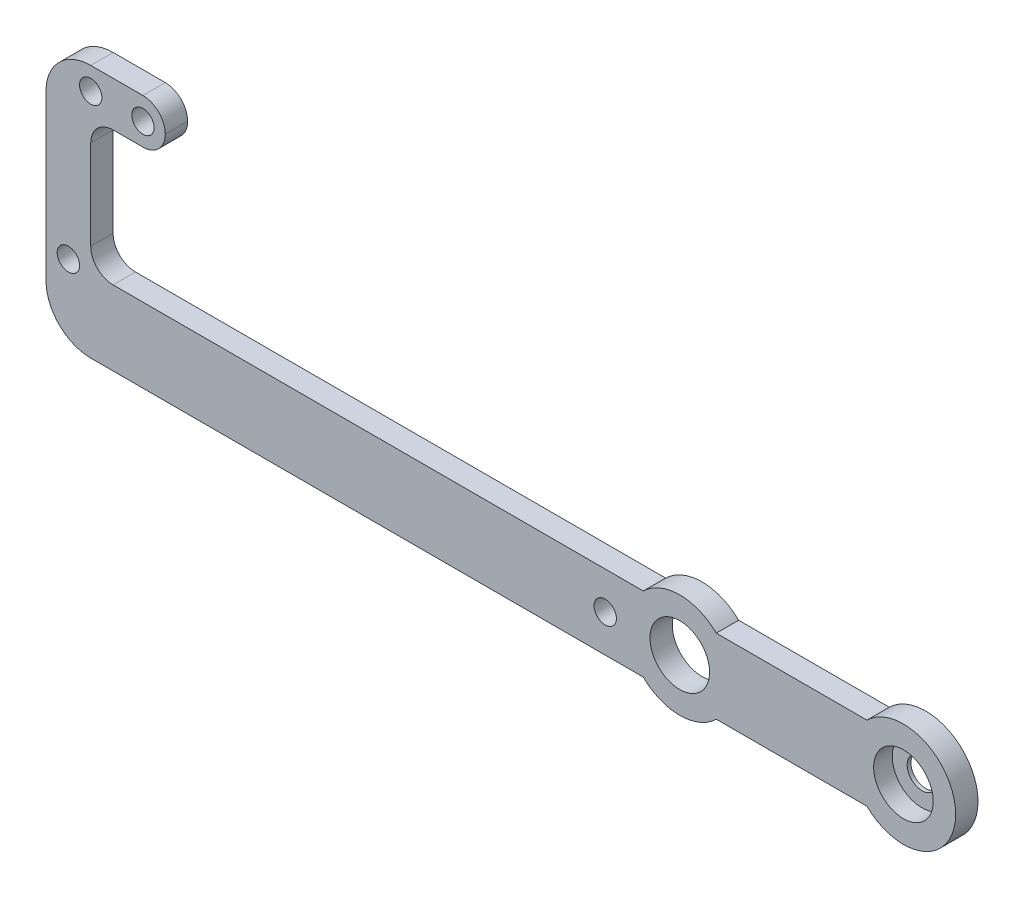
ISO-10303-21;
HEADER;
FILE_DESCRIPTION(('STEP AP214'),'2;1');
FILE_NAME('part.step','',(''),(''),'','','');
FILE_SCHEMA(('AUTOMOTIVE_DESIGN { 1 0 10303 214 1 1 1 1 }'));
ENDSEC;
DATA;
#1=APPLICATION_CONTEXT('core data for automotive mechanical design processes');
#2=APPLICATION_PROTOCOL_DEFINITION('international standard','automotive_design',2000,#1);
#3=PRODUCT_CONTEXT('',#1,'mechanical');
#4=PRODUCT('Part','Part','',(#3));
#5=PRODUCT_RELATED_PRODUCT_CATEGORY('part','',(#4));
#6=PRODUCT_DEFINITION_FORMATION('','',#4);
#7=PRODUCT_DEFINITION_CONTEXT('part definition',#1,'design');
#8=PRODUCT_DEFINITION('design','',#6,#7);
#9=PRODUCT_DEFINITION_SHAPE('','',#8);
#10=(LENGTH_UNIT() NAMED_UNIT(*) SI_UNIT(.MILLI.,.METRE.));
#11=(NAMED_UNIT(*) PLANE_ANGLE_UNIT() SI_UNIT($,.RADIAN.));
#12=(NAMED_UNIT(*) SI_UNIT($,.STERADIAN.) SOLID_ANGLE_UNIT());
#13=UNCERTAINTY_MEASURE_WITH_UNIT(LENGTH_MEASURE(1.E-05),#10,'distance_accuracy_value','');
#14=(GEOMETRIC_REPRESENTATION_CONTEXT(3) GLOBAL_UNCERTAINTY_ASSIGNED_CONTEXT((#13)) GLOBAL_UNIT_ASSIGNED_CONTEXT((#10,
#11,#12)) REPRESENTATION_CONTEXT('',''));
#15=CARTESIAN_POINT('',(0.,0.,0.));
#16=DIRECTION('',(0.,0.,1.));
#17=DIRECTION('',(1.,0.,0.));
#18=AXIS2_PLACEMENT_3D('',#15,#16,#17);
#19=CARTESIAN_POINT('',(0.,0.,3.));
#20=DIRECTION('',(1.,0.,0.));
#21=DIRECTION('',(0.,0.,-1.));
#22=AXIS2_PLACEMENT_3D('',#19,#20,#21);
#23=PLANE('',#22);
#24=DIRECTION('',(0.,-1.,0.));
#25=VECTOR('',#24,1.);
#26=CARTESIAN_POINT('',(0.,0.,0.));
#27=LINE('',#26,#25);
#28=CARTESIAN_POINT('',(0.,28.,0.));
#29=VERTEX_POINT('',#28);
#30=CARTESIAN_POINT('',(0.,6.,0.));
#31=VERTEX_POINT('',#30);
#32=EDGE_CURVE('E221',#29,#31,#27,.T.);
#33=ORIENTED_EDGE('',*,*,#32,.T.);
#34=DIRECTION('',(0.,0.,-1.));
#35=VECTOR('',#34,1.);
#36=CARTESIAN_POINT('',(0.,6.,3.));
#37=LINE('',#36,#35);
#38=CARTESIAN_POINT('',(0.,6.,3.));
#39=VERTEX_POINT('',#38);
#40=EDGE_CURVE('E63',#31,#39,#37,.F.);
#41=ORIENTED_EDGE('',*,*,#40,.T.);
#42=DIRECTION('',(0.,-1.,0.));
#43=VECTOR('',#42,1.);
#44=CARTESIAN_POINT('',(0.,0.,3.));
#45=LINE('',#44,#43);
#46=CARTESIAN_POINT('',(0.,28.,3.));
#47=VERTEX_POINT('',#46);
#48=EDGE_CURVE('E173',#47,#39,#45,.T.);
#49=ORIENTED_EDGE('',*,*,#48,.F.);
#50=DIRECTION('',(0.,0.,-1.));
#51=VECTOR('',#50,1.);
#52=CARTESIAN_POINT('',(0.,28.,3.));
#53=LINE('',#52,#51);
#54=EDGE_CURVE('E333',#47,#29,#53,.T.);
#55=ORIENTED_EDGE('',*,*,#54,.T.);
#56=EDGE_LOOP('',(#33,#41,#49,#55));
#57=FACE_BOUND('',#56,.T.);
#58=ADVANCED_FACE('F39',(#57),#23,.F.);
#59=CARTESIAN_POINT('',(0.,0.,3.));
#60=DIRECTION('',(0.,1.,0.));
#61=DIRECTION('',(0.,0.,1.));
#62=AXIS2_PLACEMENT_3D('',#59,#60,#61);
#63=PLANE('',#62);
#64=DIRECTION('',(1.,0.,0.));
#65=VECTOR('',#64,1.);
#66=CARTESIAN_POINT('',(0.,0.,3.));
#67=LINE('',#66,#65);
#68=CARTESIAN_POINT('',(6.,0.,3.));
#69=VERTEX_POINT('',#68);
#70=CARTESIAN_POINT('',(80.1010205144337,0.,3.));
#71=VERTEX_POINT('',#70);
#72=EDGE_CURVE('E162',#69,#71,#67,.T.);
#73=ORIENTED_EDGE('',*,*,#72,.F.);
#74=DIRECTION('',(0.,0.,-1.));
#75=VECTOR('',#74,1.);
#76=CARTESIAN_POINT('',(6.,0.,3.));
#77=LINE('',#76,#75);
#78=CARTESIAN_POINT('',(6.,0.,0.));
#79=VERTEX_POINT('',#78);
#80=EDGE_CURVE('E318',#69,#79,#77,.T.);
#81=ORIENTED_EDGE('',*,*,#80,.T.);
#82=DIRECTION('',(1.,0.,0.));
#83=VECTOR('',#82,1.);
#84=CARTESIAN_POINT('',(0.,0.,0.));
#85=LINE('',#84,#83);
#86=CARTESIAN_POINT('',(80.1010205144337,0.,0.));
#87=VERTEX_POINT('',#86);
#88=EDGE_CURVE('E179',#79,#87,#85,.T.);
#89=ORIENTED_EDGE('',*,*,#88,.T.);
#90=DIRECTION('',(0.,0.,-1.));
#91=VECTOR('',#90,1.);
#92=CARTESIAN_POINT('',(80.1010205144337,0.,3.));
#93=LINE('',#92,#91);
#94=EDGE_CURVE('E176',#71,#87,#93,.T.);
#95=ORIENTED_EDGE('',*,*,#94,.F.);
#96=EDGE_LOOP('',(#73,#81,#89,#95));
#97=FACE_BOUND('',#96,.T.);
#98=ADVANCED_FACE('F177',(#97),#63,.F.);
#99=CARTESIAN_POINT('',(85.,5.,3.));
#100=DIRECTION('',(0.,0.,-1.));
#101=DIRECTION('',(-1.,0.,0.));
#102=AXIS2_PLACEMENT_3D('',#99,#100,#101);
#103=CYLINDRICAL_SURFACE('',#102,7.);
#104=CARTESIAN_POINT('',(85.,5.,0.));
#105=DIRECTION('',(0.,0.,1.));
#106=DIRECTION('',(1.,0.,0.));
#107=AXIS2_PLACEMENT_3D('',#104,#105,#106);
#108=CIRCLE('',#107,7.);
#109=CARTESIAN_POINT('',(89.8989794855664,0.,0.));
#110=VERTEX_POINT('',#109);
#111=EDGE_CURVE('E227',#87,#110,#108,.T.);
#112=ORIENTED_EDGE('',*,*,#111,.T.);
#113=DIRECTION('',(0.,0.,-1.));
#114=VECTOR('',#113,1.);
#115=CARTESIAN_POINT('',(89.8989794855664,0.,3.));
#116=LINE('',#115,#114);
#117=CARTESIAN_POINT('',(89.8989794855664,0.,3.));
#118=VERTEX_POINT('',#117);
#119=EDGE_CURVE('E184',#118,#110,#116,.T.);
#120=ORIENTED_EDGE('',*,*,#119,.F.);
#121=CARTESIAN_POINT('',(85.,5.,3.));
#122=DIRECTION('',(0.,0.,1.));
#123=DIRECTION('',(1.,0.,0.));
#124=AXIS2_PLACEMENT_3D('',#121,#122,#123);
#125=CIRCLE('',#124,7.);
#126=EDGE_CURVE('E166',#71,#118,#125,.T.);
#127=ORIENTED_EDGE('',*,*,#126,.F.);
#128=ORIENTED_EDGE('',*,*,#94,.T.);
#129=EDGE_LOOP('',(#112,#120,#127,#128));
#130=FACE_BOUND('',#129,.T.);
#131=ADVANCED_FACE('F186',(#130),#103,.T.);
#132=CARTESIAN_POINT('',(89.8989794855664,0.,3.));
#133=DIRECTION('',(0.,1.,0.));
#134=DIRECTION('',(-1.,0.,0.));
#135=AXIS2_PLACEMENT_3D('',#132,#133,#134);
#136=PLANE('',#135);
#137=DIRECTION('',(1.,0.,0.));
#138=VECTOR('',#137,1.);
#139=CARTESIAN_POINT('',(89.8989794855664,0.,0.));
#140=LINE('',#139,#138);
#141=CARTESIAN_POINT('',(110.101020514434,0.,0.));
#142=VERTEX_POINT('',#141);
#143=EDGE_CURVE('E230',#110,#142,#140,.T.);
#144=ORIENTED_EDGE('',*,*,#143,.T.);
#145=DIRECTION('',(0.,0.,-1.));
#146=VECTOR('',#145,1.);
#147=CARTESIAN_POINT('',(110.101020514434,0.,3.));
#148=LINE('',#147,#146);
#149=CARTESIAN_POINT('',(110.101020514434,0.,3.));
#150=VERTEX_POINT('',#149);
#151=EDGE_CURVE('E268',#150,#142,#148,.T.);
#152=ORIENTED_EDGE('',*,*,#151,.F.);
#153=DIRECTION('',(1.,0.,0.));
#154=VECTOR('',#153,1.);
#155=CARTESIAN_POINT('',(89.8989794855664,0.,3.));
#156=LINE('',#155,#154);
#157=EDGE_CURVE('E190',#118,#150,#156,.T.);
#158=ORIENTED_EDGE('',*,*,#157,.F.);
#159=ORIENTED_EDGE('',*,*,#119,.T.);
#160=EDGE_LOOP('',(#144,#152,#158,#159));
#161=FACE_BOUND('',#160,.T.);
#162=ADVANCED_FACE('F376',(#161),#136,.F.);
#163=CARTESIAN_POINT('',(115.,5.,3.));
#164=DIRECTION('',(0.,0.,-1.));
#165=DIRECTION('',(-1.,0.,0.));
#166=AXIS2_PLACEMENT_3D('',#163,#164,#165);
#167=CYLINDRICAL_SURFACE('',#166,7.);
#168=CARTESIAN_POINT('',(115.,5.,0.));
#169=DIRECTION('',(0.,0.,1.));
#170=DIRECTION('',(1.,0.,0.));
#171=AXIS2_PLACEMENT_3D('',#168,#169,#170);
#172=CIRCLE('',#171,7.);
#173=CARTESIAN_POINT('',(110.101020514434,10.,0.));
#174=VERTEX_POINT('',#173);
#175=EDGE_CURVE('E233',#142,#174,#172,.T.);
#176=ORIENTED_EDGE('',*,*,#175,.T.);
#177=DIRECTION('',(0.,0.,-1.));
#178=VECTOR('',#177,1.);
#179=CARTESIAN_POINT('',(110.101020514434,10.,3.));
#180=LINE('',#179,#178);
#181=CARTESIAN_POINT('',(110.101020514434,10.,3.));
#182=VERTEX_POINT('',#181);
#183=EDGE_CURVE('E264',#182,#174,#180,.T.);
#184=ORIENTED_EDGE('',*,*,#183,.F.);
#185=CARTESIAN_POINT('',(115.,5.,3.));
#186=DIRECTION('',(0.,0.,1.));
#187=DIRECTION('',(1.,0.,0.));
#188=AXIS2_PLACEMENT_3D('',#185,#186,#187);
#189=CIRCLE('',#188,7.);
#190=EDGE_CURVE('E193',#150,#182,#189,.T.);
#191=ORIENTED_EDGE('',*,*,#190,.F.);
#192=ORIENTED_EDGE('',*,*,#151,.T.);
#193=EDGE_LOOP('',(#176,#184,#191,#192));
#194=FACE_BOUND('',#193,.T.);
#195=ADVANCED_FACE('F383',(#194),#167,.T.);
#196=CARTESIAN_POINT('',(110.101020514434,10.,3.));
#197=DIRECTION('',(0.,-1.,0.));
#198=DIRECTION('',(1.,0.,0.));
#199=AXIS2_PLACEMENT_3D('',#196,#197,#198);
#200=PLANE('',#199);
#201=DIRECTION('',(-1.,0.,0.));
#202=VECTOR('',#201,1.);
#203=CARTESIAN_POINT('',(110.101020514434,10.,0.));
#204=LINE('',#203,#202);
#205=CARTESIAN_POINT('',(89.8989794855664,10.,0.));
#206=VERTEX_POINT('',#205);
#207=EDGE_CURVE('E236',#174,#206,#204,.T.);
#208=ORIENTED_EDGE('',*,*,#207,.T.);
#209=DIRECTION('',(0.,0.,-1.));
#210=VECTOR('',#209,1.);
#211=CARTESIAN_POINT('',(89.8989794855664,10.,3.));
#212=LINE('',#211,#210);
#213=CARTESIAN_POINT('',(89.8989794855664,10.,3.));
#214=VERTEX_POINT('',#213);
#215=EDGE_CURVE('E260',#214,#206,#212,.T.);
#216=ORIENTED_EDGE('',*,*,#215,.F.);
#217=DIRECTION('',(-1.,0.,0.));
#218=VECTOR('',#217,1.);
#219=CARTESIAN_POINT('',(110.101020514434,10.,3.));
#220=LINE('',#219,#218);
#221=EDGE_CURVE('E199',#182,#214,#220,.T.);
#222=ORIENTED_EDGE('',*,*,#221,.F.);
#223=ORIENTED_EDGE('',*,*,#183,.T.);
#224=EDGE_LOOP('',(#208,#216,#222,#223));
#225=FACE_BOUND('',#224,.T.);
#226=ADVANCED_FACE('F386',(#225),#200,.F.);
#227=CARTESIAN_POINT('',(85.,5.,3.));
#228=DIRECTION('',(0.,0.,-1.));
#229=DIRECTION('',(-1.,0.,0.));
#230=AXIS2_PLACEMENT_3D('',#227,#228,#229);
#231=CYLINDRICAL_SURFACE('',#230,7.);
#232=CARTESIAN_POINT('',(85.,5.,0.));
#233=DIRECTION('',(0.,0.,1.));
#234=DIRECTION('',(1.,0.,0.));
#235=AXIS2_PLACEMENT_3D('',#232,#233,#234);
#236=CIRCLE('',#235,7.);
#237=CARTESIAN_POINT('',(80.1010205144336,10.,0.));
#238=VERTEX_POINT('',#237);
#239=EDGE_CURVE('E239',#206,#238,#236,.T.);
#240=ORIENTED_EDGE('',*,*,#239,.T.);
#241=DIRECTION('',(0.,0.,-1.));
#242=VECTOR('',#241,1.);
#243=CARTESIAN_POINT('',(80.1010205144336,10.,3.));
#244=LINE('',#243,#242);
#245=CARTESIAN_POINT('',(80.1010205144336,10.,3.));
#246=VERTEX_POINT('',#245);
#247=EDGE_CURVE('E220',#246,#238,#244,.T.);
#248=ORIENTED_EDGE('',*,*,#247,.F.);
#249=CARTESIAN_POINT('',(85.,5.,3.));
#250=DIRECTION('',(0.,0.,1.));
#251=DIRECTION('',(1.,0.,0.));
#252=AXIS2_PLACEMENT_3D('',#249,#250,#251);
#253=CIRCLE('',#252,7.);
#254=EDGE_CURVE('E202',#214,#246,#253,.T.);
#255=ORIENTED_EDGE('',*,*,#254,.F.);
#256=ORIENTED_EDGE('',*,*,#215,.T.);
#257=EDGE_LOOP('',(#240,#248,#255,#256));
#258=FACE_BOUND('',#257,.T.);
#259=ADVANCED_FACE('F391',(#258),#231,.T.);
#260=CARTESIAN_POINT('',(80.1010205144336,10.,3.));
#261=DIRECTION('',(0.,-1.,0.));
#262=DIRECTION('',(1.,0.,0.));
#263=AXIS2_PLACEMENT_3D('',#260,#261,#262);
#264=PLANE('',#263);
#265=DIRECTION('',(-1.,0.,0.));
#266=VECTOR('',#265,1.);
#267=CARTESIAN_POINT('',(80.1010205144336,10.,0.));
#268=LINE('',#267,#266);
#269=CARTESIAN_POINT('',(9.00000000000004,9.99999999999999,0.));
#270=VERTEX_POINT('',#269);
#271=EDGE_CURVE('E242',#238,#270,#268,.T.);
#272=ORIENTED_EDGE('',*,*,#271,.T.);
#273=DIRECTION('',(0.,0.,-1.));
#274=VECTOR('',#273,1.);
#275=CARTESIAN_POINT('',(9.00000000000001,9.99999999999999,3.));
#276=LINE('',#275,#274);
#277=CARTESIAN_POINT('',(9.00000000000004,9.99999999999999,3.));
#278=VERTEX_POINT('',#277);
#279=EDGE_CURVE('E280',#270,#278,#276,.F.);
#280=ORIENTED_EDGE('',*,*,#279,.T.);
#281=DIRECTION('',(-1.,0.,0.));
#282=VECTOR('',#281,1.);
#283=CARTESIAN_POINT('',(80.1010205144336,10.,3.));
#284=LINE('',#283,#282);
#285=EDGE_CURVE('E205',#246,#278,#284,.T.);
#286=ORIENTED_EDGE('',*,*,#285,.F.);
#287=ORIENTED_EDGE('',*,*,#247,.T.);
#288=EDGE_LOOP('',(#272,#280,#286,#287));
#289=FACE_BOUND('',#288,.T.);
#290=ADVANCED_FACE('F480',(#289),#264,.F.);
#291=CARTESIAN_POINT('',(6.,28.,3.));
#292=DIRECTION('',(-1.,0.,0.));
#293=DIRECTION('',(0.,-1.,0.));
#294=AXIS2_PLACEMENT_3D('',#291,#292,#293);
#295=PLANE('',#294);
#296=DIRECTION('',(0.,1.,0.));
#297=VECTOR('',#296,1.);
#298=CARTESIAN_POINT('',(6.,28.,3.));
#299=LINE('',#298,#297);
#300=CARTESIAN_POINT('',(6.00000000000001,13.,3.));
#301=VERTEX_POINT('',#300);
#302=CARTESIAN_POINT('',(6.,25.,3.));
#303=VERTEX_POINT('',#302);
#304=EDGE_CURVE('E209',#301,#303,#299,.T.);
#305=ORIENTED_EDGE('',*,*,#304,.F.);
#306=DIRECTION('',(0.,0.,-1.));
#307=VECTOR('',#306,1.);
#308=CARTESIAN_POINT('',(6.00000000000001,13.,0.));
#309=LINE('',#308,#307);
#310=CARTESIAN_POINT('',(6.00000000000001,13.,0.));
#311=VERTEX_POINT('',#310);
#312=EDGE_CURVE('E276',#301,#311,#309,.T.);
#313=ORIENTED_EDGE('',*,*,#312,.T.);
#314=DIRECTION('',(0.,1.,0.));
#315=VECTOR('',#314,1.);
#316=CARTESIAN_POINT('',(6.,28.,0.));
#317=LINE('',#316,#315);
#318=CARTESIAN_POINT('',(6.,25.,0.));
#319=VERTEX_POINT('',#318);
#320=EDGE_CURVE('E246',#311,#319,#317,.T.);
#321=ORIENTED_EDGE('',*,*,#320,.T.);
#322=DIRECTION('',(0.,0.,-1.));
#323=VECTOR('',#322,1.);
#324=CARTESIAN_POINT('',(6.,25.,3.));
#325=LINE('',#324,#323);
#326=EDGE_CURVE('E183',#319,#303,#325,.F.);
#327=ORIENTED_EDGE('',*,*,#326,.T.);
#328=EDGE_LOOP('',(#305,#313,#321,#327));
#329=FACE_BOUND('',#328,.T.);
#330=ADVANCED_FACE('F402',(#329),#295,.F.);
#331=CARTESIAN_POINT('',(16.,28.,3.));
#332=DIRECTION('',(0.,1.,0.));
#333=DIRECTION('',(-1.,0.,0.));
#334=AXIS2_PLACEMENT_3D('',#331,#332,#333);
#335=PLANE('',#334);
#336=DIRECTION('',(1.,0.,0.));
#337=VECTOR('',#336,1.);
#338=CARTESIAN_POINT('',(16.,28.,0.));
#339=LINE('',#338,#337);
#340=CARTESIAN_POINT('',(9.,28.,0.));
#341=VERTEX_POINT('',#340);
#342=CARTESIAN_POINT('',(13.,28.,0.));
#343=VERTEX_POINT('',#342);
#344=EDGE_CURVE('E250',#341,#343,#339,.T.);
#345=ORIENTED_EDGE('',*,*,#344,.T.);
#346=DIRECTION('',(0.,0.,-1.));
#347=VECTOR('',#346,1.);
#348=CARTESIAN_POINT('',(13.,28.,3.));
#349=LINE('',#348,#347);
#350=CARTESIAN_POINT('',(13.,28.,3.));
#351=VERTEX_POINT('',#350);
#352=EDGE_CURVE('E303',#343,#351,#349,.F.);
#353=ORIENTED_EDGE('',*,*,#352,.T.);
#354=DIRECTION('',(1.,0.,0.));
#355=VECTOR('',#354,1.);
#356=CARTESIAN_POINT('',(16.,28.,3.));
#357=LINE('',#356,#355);
#358=CARTESIAN_POINT('',(9.,28.,3.));
#359=VERTEX_POINT('',#358);
#360=EDGE_CURVE('E213',#359,#351,#357,.T.);
#361=ORIENTED_EDGE('',*,*,#360,.F.);
#362=DIRECTION('',(0.,0.,-1.));
#363=VECTOR('',#362,1.);
#364=CARTESIAN_POINT('',(9.,28.,0.));
#365=LINE('',#364,#363);
#366=EDGE_CURVE('E299',#359,#341,#365,.T.);
#367=ORIENTED_EDGE('',*,*,#366,.T.);
#368=EDGE_LOOP('',(#345,#353,#361,#367));
#369=FACE_BOUND('',#368,.T.);
#370=ADVANCED_FACE('F412',(#369),#335,.F.);
#371=CARTESIAN_POINT('',(0.,34.,3.));
#372=DIRECTION('',(0.,-1.,0.));
#373=DIRECTION('',(1.,0.,0.));
#374=AXIS2_PLACEMENT_3D('',#371,#372,#373);
#375=PLANE('',#374);
#376=DIRECTION('',(-1.,0.,0.));
#377=VECTOR('',#376,1.);
#378=CARTESIAN_POINT('',(0.,34.,0.));
#379=LINE('',#378,#377);
#380=CARTESIAN_POINT('',(13.,34.,0.));
#381=VERTEX_POINT('',#380);
#382=CARTESIAN_POINT('',(6.,34.,0.));
#383=VERTEX_POINT('',#382);
#384=EDGE_CURVE('E254',#381,#383,#379,.T.);
#385=ORIENTED_EDGE('',*,*,#384,.T.);
#386=DIRECTION('',(0.,0.,-1.));
#387=VECTOR('',#386,1.);
#388=CARTESIAN_POINT('',(6.,34.,3.));
#389=LINE('',#388,#387);
#390=CARTESIAN_POINT('',(6.,34.,3.));
#391=VERTEX_POINT('',#390);
#392=EDGE_CURVE('E11',#383,#391,#389,.F.);
#393=ORIENTED_EDGE('',*,*,#392,.T.);
#394=DIRECTION('',(-1.,0.,0.));
#395=VECTOR('',#394,1.);
#396=CARTESIAN_POINT('',(0.,34.,3.));
#397=LINE('',#396,#395);
#398=CARTESIAN_POINT('',(13.,34.,3.));
#399=VERTEX_POINT('',#398);
#400=EDGE_CURVE('E217',#399,#391,#397,.T.);
#401=ORIENTED_EDGE('',*,*,#400,.F.);
#402=DIRECTION('',(0.,0.,-1.));
#403=VECTOR('',#402,1.);
#404=CARTESIAN_POINT('',(13.,34.,3.));
#405=LINE('',#404,#403);
#406=EDGE_CURVE('E283',#399,#381,#405,.T.);
#407=ORIENTED_EDGE('',*,*,#406,.T.);
#408=EDGE_LOOP('',(#385,#393,#401,#407));
#409=FACE_BOUND('',#408,.T.);
#410=ADVANCED_FACE('F423',(#409),#375,.F.);
#411=CARTESIAN_POINT('',(85.,5.,3.));
#412=DIRECTION('',(0.,0.,1.));
#413=DIRECTION('',(1.,0.,0.));
#414=AXIS2_PLACEMENT_3D('',#411,#412,#413);
#415=PLANE('',#414);
#416=CARTESIAN_POINT('',(3.,10.,3.));
#417=DIRECTION('',(0.,0.,1.));
#418=DIRECTION('',(1.,0.,0.));
#419=AXIS2_PLACEMENT_3D('',#416,#417,#418);
#420=CIRCLE('',#419,1.5);
#421=CARTESIAN_POINT('',(4.5,10.,3.));
#422=VERTEX_POINT('',#421);
#423=EDGE_CURVE('E689',#422,#422,#420,.F.);
#424=ORIENTED_EDGE('',*,*,#423,.T.);
#425=EDGE_LOOP('',(#424));
#426=FACE_BOUND('',#425,.T.);
#427=CARTESIAN_POINT('',(13.,31.,3.));
#428=DIRECTION('',(0.,0.,1.));
#429=DIRECTION('',(1.,0.,0.));
#430=AXIS2_PLACEMENT_3D('',#427,#428,#429);
#431=CIRCLE('',#430,1.5);
#432=CARTESIAN_POINT('',(14.5,31.,3.));
#433=VERTEX_POINT('',#432);
#434=EDGE_CURVE('E685',#433,#433,#431,.F.);
#435=ORIENTED_EDGE('',*,*,#434,.T.);
#436=EDGE_LOOP('',(#435));
#437=FACE_BOUND('',#436,.T.);
#438=CARTESIAN_POINT('',(6.,31.,3.));
#439=DIRECTION('',(0.,0.,1.));
#440=DIRECTION('',(1.,0.,0.));
#441=AXIS2_PLACEMENT_3D('',#438,#439,#440);
#442=CIRCLE('',#441,1.5);
#443=CARTESIAN_POINT('',(7.5,31.,3.));
#444=VERTEX_POINT('',#443);
#445=EDGE_CURVE('E674',#444,#444,#442,.F.);
#446=ORIENTED_EDGE('',*,*,#445,.T.);
#447=EDGE_LOOP('',(#446));
#448=FACE_BOUND('',#447,.T.);
#449=CARTESIAN_POINT('',(75.,5.,3.));
#450=DIRECTION('',(0.,0.,1.));
#451=DIRECTION('',(1.,0.,0.));
#452=AXIS2_PLACEMENT_3D('',#449,#450,#451);
#453=CIRCLE('',#452,1.5);
#454=CARTESIAN_POINT('',(76.5,5.,3.));
#455=VERTEX_POINT('',#454);
#456=EDGE_CURVE('E350',#455,#455,#453,.F.);
#457=ORIENTED_EDGE('',*,*,#456,.T.);
#458=EDGE_LOOP('',(#457));
#459=FACE_BOUND('',#458,.T.);
#460=CARTESIAN_POINT('',(85.,5.,3.));
#461=DIRECTION('',(0.,0.,1.));
#462=DIRECTION('',(1.,0.,0.));
#463=AXIS2_PLACEMENT_3D('',#460,#461,#462);
#464=CIRCLE('',#463,4.00000000000001);
#465=CARTESIAN_POINT('',(89.,5.,3.));
#466=VERTEX_POINT('',#465);
#467=EDGE_CURVE('E345',#466,#466,#464,.T.);
#468=ORIENTED_EDGE('',*,*,#467,.F.);
#469=EDGE_LOOP('',(#468));
#470=FACE_BOUND('',#469,.T.);
#471=CARTESIAN_POINT('',(115.,5.,3.));
#472=DIRECTION('',(0.,0.,1.));
#473=DIRECTION('',(1.,0.,0.));
#474=AXIS2_PLACEMENT_3D('',#471,#472,#473);
#475=CIRCLE('',#474,4.00000000000001);
#476=CARTESIAN_POINT('',(119.,5.,3.));
#477=VERTEX_POINT('',#476);
#478=EDGE_CURVE('E323',#477,#477,#475,.T.);
#479=ORIENTED_EDGE('',*,*,#478,.F.);
#480=EDGE_LOOP('',(#479));
#481=FACE_BOUND('',#480,.T.);
#482=ORIENTED_EDGE('',*,*,#48,.T.);
#483=CARTESIAN_POINT('',(6.,6.,3.));
#484=DIRECTION('',(0.,0.,1.));
#485=DIRECTION('',(1.,0.,0.));
#486=AXIS2_PLACEMENT_3D('',#483,#484,#485);
#487=CIRCLE('',#486,6.);
#488=EDGE_CURVE('E49',#39,#69,#487,.T.);
#489=ORIENTED_EDGE('',*,*,#488,.T.);
#490=ORIENTED_EDGE('',*,*,#72,.T.);
#491=ORIENTED_EDGE('',*,*,#126,.T.);
#492=ORIENTED_EDGE('',*,*,#157,.T.);
#493=ORIENTED_EDGE('',*,*,#190,.T.);
#494=ORIENTED_EDGE('',*,*,#221,.T.);
#495=ORIENTED_EDGE('',*,*,#254,.T.);
#496=ORIENTED_EDGE('',*,*,#285,.T.);
#497=CARTESIAN_POINT('',(9.00000000000001,13.,3.));
#498=DIRECTION('',(0.,0.,1.));
#499=DIRECTION('',(1.,0.,0.));
#500=AXIS2_PLACEMENT_3D('',#497,#498,#499);
#501=CIRCLE('',#500,3.);
#502=EDGE_CURVE('E309',#278,#301,#501,.F.);
#503=ORIENTED_EDGE('',*,*,#502,.T.);
#504=ORIENTED_EDGE('',*,*,#304,.T.);
#505=CARTESIAN_POINT('',(9.00000000000001,25.,3.));
#506=DIRECTION('',(0.,0.,1.));
#507=DIRECTION('',(1.,0.,0.));
#508=AXIS2_PLACEMENT_3D('',#505,#506,#507);
#509=CIRCLE('',#508,3.);
#510=EDGE_CURVE('E315',#303,#359,#509,.F.);
#511=ORIENTED_EDGE('',*,*,#510,.T.);
#512=ORIENTED_EDGE('',*,*,#360,.T.);
#513=CARTESIAN_POINT('',(13.,31.,3.));
#514=DIRECTION('',(0.,0.,1.));
#515=DIRECTION('',(1.,0.,0.));
#516=AXIS2_PLACEMENT_3D('',#513,#514,#515);
#517=CIRCLE('',#516,3.);
#518=CARTESIAN_POINT('',(16.,31.,3.));
#519=VERTEX_POINT('',#518);
#520=EDGE_CURVE('E293',#351,#519,#517,.T.);
#521=ORIENTED_EDGE('',*,*,#520,.T.);
#522=CARTESIAN_POINT('',(13.,31.,3.));
#523=DIRECTION('',(0.,0.,1.));
#524=DIRECTION('',(1.,0.,0.));
#525=AXIS2_PLACEMENT_3D('',#522,#523,#524);
#526=CIRCLE('',#525,3.);
#527=EDGE_CURVE('E296',#519,#399,#526,.T.);
#528=ORIENTED_EDGE('',*,*,#527,.T.);
#529=ORIENTED_EDGE('',*,*,#400,.T.);
#530=CARTESIAN_POINT('',(6.,28.,3.));
#531=DIRECTION('',(0.,0.,1.));
#532=DIRECTION('',(1.,0.,0.));
#533=AXIS2_PLACEMENT_3D('',#530,#531,#532);
#534=CIRCLE('',#533,6.);
#535=EDGE_CURVE('E339',#391,#47,#534,.T.);
#536=ORIENTED_EDGE('',*,*,#535,.T.);
#537=EDGE_LOOP('',(#482,#489,#490,#491,#492,#493,#494,#495,#496,#503,#504,#511,#512,#521,#528,
#529,#536));
#538=FACE_BOUND('',#537,.T.);
#539=ADVANCED_FACE('F164',(#426,#437,#448,#459,#470,#481,#538),#415,.T.);
#540=CARTESIAN_POINT('',(85.,5.,0.));
#541=DIRECTION('',(0.,0.,1.));
#542=DIRECTION('',(1.,0.,0.));
#543=AXIS2_PLACEMENT_3D('',#540,#541,#542);
#544=PLANE('',#543);
#545=CARTESIAN_POINT('',(115.,5.,0.));
#546=DIRECTION('',(0.,0.,-1.));
#547=DIRECTION('',(-1.,0.,0.));
#548=AXIS2_PLACEMENT_3D('',#545,#546,#547);
#549=CIRCLE('',#548,2.);
#550=CARTESIAN_POINT('',(113.,5.,0.));
#551=VERTEX_POINT('',#550);
#552=EDGE_CURVE('E664',#551,#551,#549,.T.);
#553=ORIENTED_EDGE('',*,*,#552,.F.);
#554=EDGE_LOOP('',(#553));
#555=FACE_BOUND('',#554,.T.);
#556=CARTESIAN_POINT('',(3.,10.,0.));
#557=DIRECTION('',(0.,0.,1.));
#558=DIRECTION('',(1.,0.,0.));
#559=AXIS2_PLACEMENT_3D('',#556,#557,#558);
#560=CIRCLE('',#559,1.5);
#561=CARTESIAN_POINT('',(4.5,10.,0.));
#562=VERTEX_POINT('',#561);
#563=EDGE_CURVE('E670',#562,#562,#560,.T.);
#564=ORIENTED_EDGE('',*,*,#563,.T.);
#565=EDGE_LOOP('',(#564));
#566=FACE_BOUND('',#565,.T.);
#567=CARTESIAN_POINT('',(13.,31.,0.));
#568=DIRECTION('',(0.,0.,1.));
#569=DIRECTION('',(1.,0.,0.));
#570=AXIS2_PLACEMENT_3D('',#567,#568,#569);
#571=CIRCLE('',#570,1.5);
#572=CARTESIAN_POINT('',(14.5,31.,0.));
#573=VERTEX_POINT('',#572);
#574=EDGE_CURVE('E675',#573,#573,#571,.T.);
#575=ORIENTED_EDGE('',*,*,#574,.T.);
#576=EDGE_LOOP('',(#575));
#577=FACE_BOUND('',#576,.T.);
#578=CARTESIAN_POINT('',(6.,31.,0.));
#579=DIRECTION('',(0.,0.,1.));
#580=DIRECTION('',(1.,0.,0.));
#581=AXIS2_PLACEMENT_3D('',#578,#579,#580);
#582=CIRCLE('',#581,1.5);
#583=CARTESIAN_POINT('',(7.5,31.,0.));
#584=VERTEX_POINT('',#583);
#585=EDGE_CURVE('E668',#584,#584,#582,.T.);
#586=ORIENTED_EDGE('',*,*,#585,.T.);
#587=EDGE_LOOP('',(#586));
#588=FACE_BOUND('',#587,.T.);
#589=CARTESIAN_POINT('',(75.,5.,0.));
#590=DIRECTION('',(0.,0.,1.));
#591=DIRECTION('',(1.,0.,0.));
#592=AXIS2_PLACEMENT_3D('',#589,#590,#591);
#593=CIRCLE('',#592,1.5);
#594=CARTESIAN_POINT('',(76.5,5.,0.));
#595=VERTEX_POINT('',#594);
#596=EDGE_CURVE('E356',#595,#595,#593,.T.);
#597=ORIENTED_EDGE('',*,*,#596,.T.);
#598=EDGE_LOOP('',(#597));
#599=FACE_BOUND('',#598,.T.);
#600=CARTESIAN_POINT('',(85.,5.,0.));
#601=DIRECTION('',(0.,0.,1.));
#602=DIRECTION('',(1.,0.,0.));
#603=AXIS2_PLACEMENT_3D('',#600,#601,#602);
#604=CIRCLE('',#603,4.00000000000001);
#605=CARTESIAN_POINT('',(89.,5.,0.));
#606=VERTEX_POINT('',#605);
#607=EDGE_CURVE('E324',#606,#606,#604,.T.);
#608=ORIENTED_EDGE('',*,*,#607,.T.);
#609=EDGE_LOOP('',(#608));
#610=FACE_BOUND('',#609,.T.);
#611=ORIENTED_EDGE('',*,*,#88,.F.);
#612=CARTESIAN_POINT('',(6.,6.,0.));
#613=DIRECTION('',(0.,0.,1.));
#614=DIRECTION('',(1.,0.,0.));
#615=AXIS2_PLACEMENT_3D('',#612,#613,#614);
#616=CIRCLE('',#615,6.);
#617=EDGE_CURVE('E330',#79,#31,#616,.F.);
#618=ORIENTED_EDGE('',*,*,#617,.T.);
#619=ORIENTED_EDGE('',*,*,#32,.F.);
#620=CARTESIAN_POINT('',(6.,28.,0.));
#621=DIRECTION('',(0.,0.,1.));
#622=DIRECTION('',(1.,0.,0.));
#623=AXIS2_PLACEMENT_3D('',#620,#621,#622);
#624=CIRCLE('',#623,6.);
#625=EDGE_CURVE('E327',#29,#383,#624,.F.);
#626=ORIENTED_EDGE('',*,*,#625,.T.);
#627=ORIENTED_EDGE('',*,*,#384,.F.);
#628=CARTESIAN_POINT('',(13.,31.,0.));
#629=DIRECTION('',(0.,0.,1.));
#630=DIRECTION('',(1.,0.,0.));
#631=AXIS2_PLACEMENT_3D('',#628,#629,#630);
#632=CIRCLE('',#631,3.);
#633=CARTESIAN_POINT('',(16.,31.,0.));
#634=VERTEX_POINT('',#633);
#635=EDGE_CURVE('E290',#381,#634,#632,.F.);
#636=ORIENTED_EDGE('',*,*,#635,.T.);
#637=CARTESIAN_POINT('',(13.,31.,0.));
#638=DIRECTION('',(0.,0.,1.));
#639=DIRECTION('',(1.,0.,0.));
#640=AXIS2_PLACEMENT_3D('',#637,#638,#639);
#641=CIRCLE('',#640,3.);
#642=EDGE_CURVE('E287',#634,#343,#641,.F.);
#643=ORIENTED_EDGE('',*,*,#642,.T.);
#644=ORIENTED_EDGE('',*,*,#344,.F.);
#645=CARTESIAN_POINT('',(9.00000000000001,25.,0.));
#646=DIRECTION('',(0.,0.,1.));
#647=DIRECTION('',(1.,0.,0.));
#648=AXIS2_PLACEMENT_3D('',#645,#646,#647);
#649=CIRCLE('',#648,3.);
#650=EDGE_CURVE('E312',#341,#319,#649,.T.);
#651=ORIENTED_EDGE('',*,*,#650,.T.);
#652=ORIENTED_EDGE('',*,*,#320,.F.);
#653=CARTESIAN_POINT('',(9.00000000000001,13.,0.));
#654=DIRECTION('',(0.,0.,1.));
#655=DIRECTION('',(1.,0.,0.));
#656=AXIS2_PLACEMENT_3D('',#653,#654,#655);
#657=CIRCLE('',#656,3.);
#658=EDGE_CURVE('E306',#311,#270,#657,.T.);
#659=ORIENTED_EDGE('',*,*,#658,.T.);
#660=ORIENTED_EDGE('',*,*,#271,.F.);
#661=ORIENTED_EDGE('',*,*,#239,.F.);
#662=ORIENTED_EDGE('',*,*,#207,.F.);
#663=ORIENTED_EDGE('',*,*,#175,.F.);
#664=ORIENTED_EDGE('',*,*,#143,.F.);
#665=ORIENTED_EDGE('',*,*,#111,.F.);
#666=EDGE_LOOP('',(#611,#618,#619,#626,#627,#636,#643,#644,#651,#652,#659,#660,#661,#662,#663,
#664,#665));
#667=FACE_BOUND('',#666,.T.);
#668=ADVANCED_FACE('F371',(#555,#566,#577,#588,#599,#610,#667),#544,.F.);
#669=CARTESIAN_POINT('',(115.,5.,0.5));
#670=DIRECTION('',(0.,0.,1.));
#671=DIRECTION('',(1.,0.,0.));
#672=AXIS2_PLACEMENT_3D('',#669,#670,#671);
#673=CYLINDRICAL_SURFACE('',#672,4.00000000000001);
#674=CARTESIAN_POINT('',(115.,5.,0.5));
#675=DIRECTION('',(0.,0.,1.));
#676=DIRECTION('',(1.,0.,0.));
#677=AXIS2_PLACEMENT_3D('',#674,#675,#676);
#678=CIRCLE('',#677,4.00000000000001);
#679=CARTESIAN_POINT('',(119.,5.,0.5));
#680=VERTEX_POINT('',#679);
#681=EDGE_CURVE('E224',#680,#680,#678,.T.);
#682=ORIENTED_EDGE('',*,*,#681,.F.);
#683=EDGE_LOOP('',(#682));
#684=FACE_BOUND('',#683,.T.);
#685=ORIENTED_EDGE('',*,*,#478,.T.);
#686=EDGE_LOOP('',(#685));
#687=FACE_BOUND('',#686,.T.);
#688=ADVANCED_FACE('F463',(#684,#687),#673,.F.);
#689=CARTESIAN_POINT('',(115.,5.,0.5));
#690=DIRECTION('',(0.,0.,1.));
#691=DIRECTION('',(1.,0.,0.));
#692=AXIS2_PLACEMENT_3D('',#689,#690,#691);
#693=PLANE('',#692);
#694=CARTESIAN_POINT('',(115.,5.,0.5));
#695=DIRECTION('',(0.,0.,1.));
#696=DIRECTION('',(1.,0.,0.));
#697=AXIS2_PLACEMENT_3D('',#694,#695,#696);
#698=CIRCLE('',#697,2.);
#699=CARTESIAN_POINT('',(117.,5.,0.5));
#700=VERTEX_POINT('',#699);
#701=EDGE_CURVE('E43',#700,#700,#698,.T.);
#702=ORIENTED_EDGE('',*,*,#701,.F.);
#703=EDGE_LOOP('',(#702));
#704=FACE_BOUND('',#703,.T.);
#705=ORIENTED_EDGE('',*,*,#681,.T.);
#706=EDGE_LOOP('',(#705));
#707=FACE_BOUND('',#706,.T.);
#708=ADVANCED_FACE('F436',(#704,#707),#693,.T.);
#709=CARTESIAN_POINT('',(9.00000000000001,13.,3.));
#710=DIRECTION('',(0.,0.,1.));
#711=DIRECTION('',(1.,0.,0.));
#712=AXIS2_PLACEMENT_3D('',#709,#710,#711);
#713=CYLINDRICAL_SURFACE('',#712,3.);
#714=ORIENTED_EDGE('',*,*,#502,.F.);
#715=ORIENTED_EDGE('',*,*,#279,.F.);
#716=ORIENTED_EDGE('',*,*,#658,.F.);
#717=ORIENTED_EDGE('',*,*,#312,.F.);
#718=EDGE_LOOP('',(#714,#715,#716,#717));
#719=FACE_BOUND('',#718,.T.);
#720=ADVANCED_FACE('F399',(#719),#713,.F.);
#721=CARTESIAN_POINT('',(13.,31.,3.));
#722=DIRECTION('',(0.,0.,-1.));
#723=DIRECTION('',(-1.,0.,0.));
#724=AXIS2_PLACEMENT_3D('',#721,#722,#723);
#725=CYLINDRICAL_SURFACE('',#724,3.);
#726=DIRECTION('',(0.,0.,-1.));
#727=VECTOR('',#726,1.);
#728=CARTESIAN_POINT('',(16.,31.,3.));
#729=LINE('',#728,#727);
#730=EDGE_CURVE('E319',#519,#634,#729,.T.);
#731=ORIENTED_EDGE('',*,*,#730,.F.);
#732=ORIENTED_EDGE('',*,*,#520,.F.);
#733=ORIENTED_EDGE('',*,*,#352,.F.);
#734=ORIENTED_EDGE('',*,*,#642,.F.);
#735=EDGE_LOOP('',(#731,#732,#733,#734));
#736=FACE_BOUND('',#735,.T.);
#737=ADVANCED_FACE('F417',(#736),#725,.T.);
#738=CARTESIAN_POINT('',(13.,31.,3.));
#739=DIRECTION('',(0.,0.,-1.));
#740=DIRECTION('',(-1.,0.,0.));
#741=AXIS2_PLACEMENT_3D('',#738,#739,#740);
#742=CYLINDRICAL_SURFACE('',#741,3.);
#743=ORIENTED_EDGE('',*,*,#527,.F.);
#744=ORIENTED_EDGE('',*,*,#730,.T.);
#745=ORIENTED_EDGE('',*,*,#635,.F.);
#746=ORIENTED_EDGE('',*,*,#406,.F.);
#747=EDGE_LOOP('',(#743,#744,#745,#746));
#748=FACE_BOUND('',#747,.T.);
#749=ADVANCED_FACE('F422',(#748),#742,.T.);
#750=CARTESIAN_POINT('',(9.00000000000001,25.,3.));
#751=DIRECTION('',(0.,0.,1.));
#752=DIRECTION('',(1.,0.,0.));
#753=AXIS2_PLACEMENT_3D('',#750,#751,#752);
#754=CYLINDRICAL_SURFACE('',#753,3.);
#755=ORIENTED_EDGE('',*,*,#510,.F.);
#756=ORIENTED_EDGE('',*,*,#326,.F.);
#757=ORIENTED_EDGE('',*,*,#650,.F.);
#758=ORIENTED_EDGE('',*,*,#366,.F.);
#759=EDGE_LOOP('',(#755,#756,#757,#758));
#760=FACE_BOUND('',#759,.T.);
#761=ADVANCED_FACE('F409',(#760),#754,.F.);
#762=CARTESIAN_POINT('',(6.,6.,3.));
#763=DIRECTION('',(0.,0.,-1.));
#764=DIRECTION('',(-1.,0.,0.));
#765=AXIS2_PLACEMENT_3D('',#762,#763,#764);
#766=CYLINDRICAL_SURFACE('',#765,6.);
#767=ORIENTED_EDGE('',*,*,#488,.F.);
#768=ORIENTED_EDGE('',*,*,#40,.F.);
#769=ORIENTED_EDGE('',*,*,#617,.F.);
#770=ORIENTED_EDGE('',*,*,#80,.F.);
#771=EDGE_LOOP('',(#767,#768,#769,#770));
#772=FACE_BOUND('',#771,.T.);
#773=ADVANCED_FACE('F369',(#772),#766,.T.);
#774=CARTESIAN_POINT('',(6.,28.,3.));
#775=DIRECTION('',(0.,0.,-1.));
#776=DIRECTION('',(-1.,0.,0.));
#777=AXIS2_PLACEMENT_3D('',#774,#775,#776);
#778=CYLINDRICAL_SURFACE('',#777,6.);
#779=ORIENTED_EDGE('',*,*,#535,.F.);
#780=ORIENTED_EDGE('',*,*,#392,.F.);
#781=ORIENTED_EDGE('',*,*,#625,.F.);
#782=ORIENTED_EDGE('',*,*,#54,.F.);
#783=EDGE_LOOP('',(#779,#780,#781,#782));
#784=FACE_BOUND('',#783,.T.);
#785=ADVANCED_FACE('F41',(#784),#778,.T.);
#786=CARTESIAN_POINT('',(85.,5.,-1.));
#787=DIRECTION('',(0.,0.,1.));
#788=DIRECTION('',(1.,0.,0.));
#789=AXIS2_PLACEMENT_3D('',#786,#787,#788);
#790=CYLINDRICAL_SURFACE('',#789,4.00000000000001);
#791=ORIENTED_EDGE('',*,*,#467,.T.);
#792=EDGE_LOOP('',(#791));
#793=FACE_BOUND('',#792,.T.);
#794=ORIENTED_EDGE('',*,*,#607,.F.);
#795=EDGE_LOOP('',(#794));
#796=FACE_BOUND('',#795,.T.);
#797=ADVANCED_FACE('F446',(#793,#796),#790,.F.);
#798=CARTESIAN_POINT('',(75.,5.,10.));
#799=DIRECTION('',(0.,0.,-1.));
#800=DIRECTION('',(-1.,0.,0.));
#801=AXIS2_PLACEMENT_3D('',#798,#799,#800);
#802=CYLINDRICAL_SURFACE('',#801,1.5);
#803=ORIENTED_EDGE('',*,*,#456,.F.);
#804=EDGE_LOOP('',(#803));
#805=FACE_BOUND('',#804,.T.);
#806=ORIENTED_EDGE('',*,*,#596,.F.);
#807=EDGE_LOOP('',(#806));
#808=FACE_BOUND('',#807,.T.);
#809=ADVANCED_FACE('F450',(#805,#808),#802,.F.);
#810=CARTESIAN_POINT('',(6.,31.,10.));
#811=DIRECTION('',(0.,0.,-1.));
#812=DIRECTION('',(-1.,0.,0.));
#813=AXIS2_PLACEMENT_3D('',#810,#811,#812);
#814=CYLINDRICAL_SURFACE('',#813,1.5);
#815=ORIENTED_EDGE('',*,*,#445,.F.);
#816=EDGE_LOOP('',(#815));
#817=FACE_BOUND('',#816,.T.);
#818=ORIENTED_EDGE('',*,*,#585,.F.);
#819=EDGE_LOOP('',(#818));
#820=FACE_BOUND('',#819,.T.);
#821=ADVANCED_FACE('F455',(#817,#820),#814,.F.);
#822=CARTESIAN_POINT('',(13.,31.,10.));
#823=DIRECTION('',(0.,0.,-1.));
#824=DIRECTION('',(-1.,0.,0.));
#825=AXIS2_PLACEMENT_3D('',#822,#823,#824);
#826=CYLINDRICAL_SURFACE('',#825,1.5);
#827=ORIENTED_EDGE('',*,*,#434,.F.);
#828=EDGE_LOOP('',(#827));
#829=FACE_BOUND('',#828,.T.);
#830=ORIENTED_EDGE('',*,*,#574,.F.);
#831=EDGE_LOOP('',(#830));
#832=FACE_BOUND('',#831,.T.);
#833=ADVANCED_FACE('F628',(#829,#832),#826,.F.);
#834=CARTESIAN_POINT('',(3.,10.,10.));
#835=DIRECTION('',(0.,0.,-1.));
#836=DIRECTION('',(-1.,0.,0.));
#837=AXIS2_PLACEMENT_3D('',#834,#835,#836);
#838=CYLINDRICAL_SURFACE('',#837,1.5);
#839=ORIENTED_EDGE('',*,*,#423,.F.);
#840=EDGE_LOOP('',(#839));
#841=FACE_BOUND('',#840,.T.);
#842=ORIENTED_EDGE('',*,*,#563,.F.);
#843=EDGE_LOOP('',(#842));
#844=FACE_BOUND('',#843,.T.);
#845=ADVANCED_FACE('F636',(#841,#844),#838,.F.);
#846=CARTESIAN_POINT('',(115.,5.,10.));
#847=DIRECTION('',(0.,0.,-1.));
#848=DIRECTION('',(-1.,0.,0.));
#849=AXIS2_PLACEMENT_3D('',#846,#847,#848);
#850=CYLINDRICAL_SURFACE('',#849,2.);
#851=ORIENTED_EDGE('',*,*,#701,.T.);
#852=EDGE_LOOP('',(#851));
#853=FACE_BOUND('',#852,.T.);
#854=ORIENTED_EDGE('',*,*,#552,.T.);
#855=EDGE_LOOP('',(#854));
#856=FACE_BOUND('',#855,.T.);
#857=ADVANCED_FACE('F644',(#853,#856),#850,.F.);
#858=CLOSED_SHELL('',(#58,#98,#131,#162,#195,#226,#259,#290,#330,#370,#410,#539,#668,#688,#708,
#720,#737,#749,#761,#773,#785,#797,#809,#821,#833,#845,#857));
#859=MANIFOLD_SOLID_BREP('B2',#858);
#860=ADVANCED_BREP_SHAPE_REPRESENTATION('',(#18,#859),#14);
#861=SHAPE_DEFINITION_REPRESENTATION(#9,#860);
ENDSEC;
END-ISO-10303-21;
